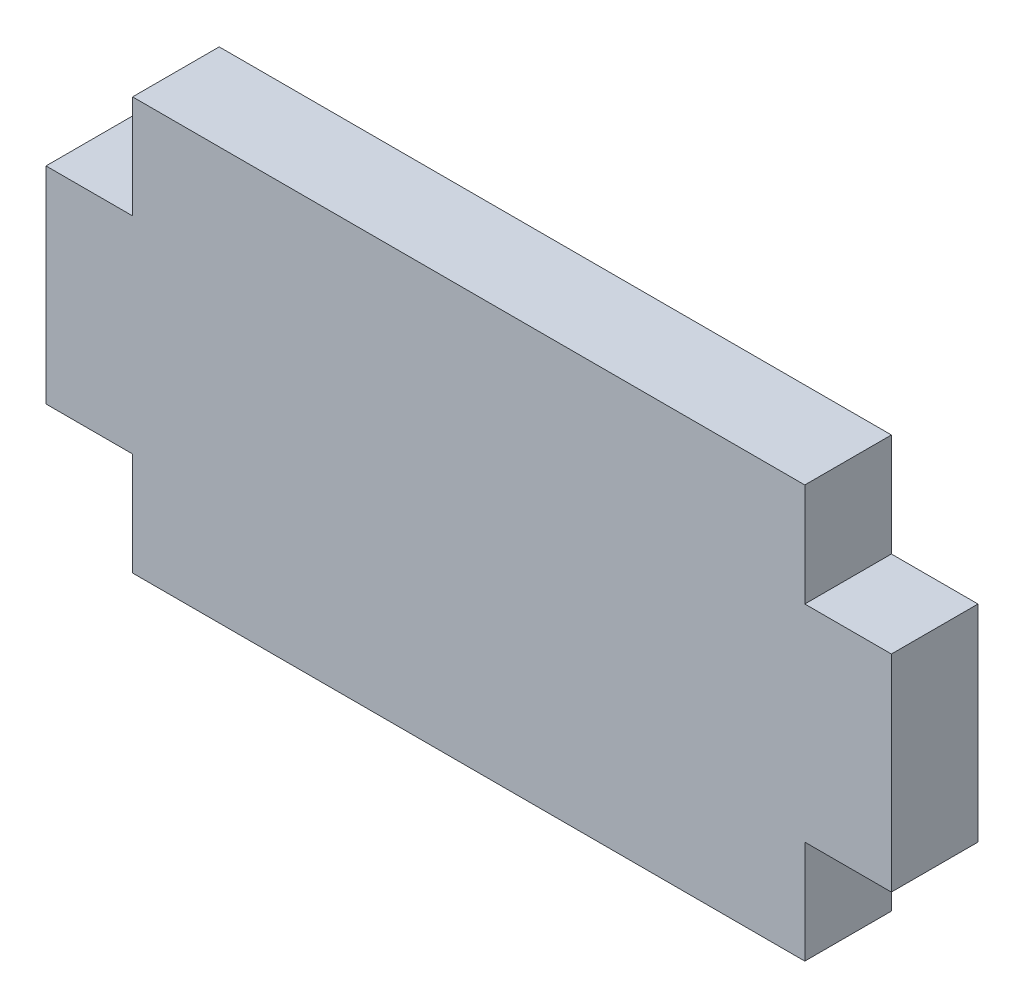
ISO-10303-21;
HEADER;
FILE_DESCRIPTION(('STEP AP214'),'2;1');
FILE_NAME('part.step','',(''),(''),'','','');
FILE_SCHEMA(('AUTOMOTIVE_DESIGN { 1 0 10303 214 1 1 1 1 }'));
ENDSEC;
DATA;
#1=APPLICATION_CONTEXT('core data for automotive mechanical design processes');
#2=APPLICATION_PROTOCOL_DEFINITION('international standard','automotive_design',2000,#1);
#3=PRODUCT_CONTEXT('',#1,'mechanical');
#4=PRODUCT('Part','Part','',(#3));
#5=PRODUCT_RELATED_PRODUCT_CATEGORY('part','',(#4));
#6=PRODUCT_DEFINITION_FORMATION('','',#4);
#7=PRODUCT_DEFINITION_CONTEXT('part definition',#1,'design');
#8=PRODUCT_DEFINITION('design','',#6,#7);
#9=PRODUCT_DEFINITION_SHAPE('','',#8);
#10=(LENGTH_UNIT() NAMED_UNIT(*) SI_UNIT(.MILLI.,.METRE.));
#11=(NAMED_UNIT(*) PLANE_ANGLE_UNIT() SI_UNIT($,.RADIAN.));
#12=(NAMED_UNIT(*) SI_UNIT($,.STERADIAN.) SOLID_ANGLE_UNIT());
#13=UNCERTAINTY_MEASURE_WITH_UNIT(LENGTH_MEASURE(1.E-05),#10,'distance_accuracy_value','');
#14=(GEOMETRIC_REPRESENTATION_CONTEXT(3) GLOBAL_UNCERTAINTY_ASSIGNED_CONTEXT((#13)) GLOBAL_UNIT_ASSIGNED_CONTEXT((#10,
#11,#12)) REPRESENTATION_CONTEXT('',''));
#15=CARTESIAN_POINT('',(0.,0.,0.));
#16=DIRECTION('',(0.,0.,1.));
#17=DIRECTION('',(1.,0.,0.));
#18=AXIS2_PLACEMENT_3D('',#15,#16,#17);
#19=CARTESIAN_POINT('',(-112.840766510892,6.6832526068117,5.334));
#20=DIRECTION('',(1.,0.,0.));
#21=DIRECTION('',(0.,0.,-1.));
#22=AXIS2_PLACEMENT_3D('',#19,#20,#21);
#23=PLANE('',#22);
#24=DIRECTION('',(0.,-1.,0.));
#25=VECTOR('',#24,1.);
#26=CARTESIAN_POINT('',(-112.840766510892,6.6832526068117,0.));
#27=LINE('',#26,#25);
#28=CARTESIAN_POINT('',(-112.840766510892,0.333252606811682,0.));
#29=VERTEX_POINT('',#28);
#30=CARTESIAN_POINT('',(-112.840766510892,-12.3667473931883,0.));
#31=VERTEX_POINT('',#30);
#32=EDGE_CURVE('E156',#29,#31,#27,.T.);
#33=ORIENTED_EDGE('',*,*,#32,.T.);
#34=DIRECTION('',(0.,0.,1.));
#35=VECTOR('',#34,1.);
#36=CARTESIAN_POINT('',(-112.840766510892,-12.3667473931883,0.));
#37=LINE('',#36,#35);
#38=CARTESIAN_POINT('',(-112.840766510892,-12.3667473931883,5.334));
#39=VERTEX_POINT('',#38);
#40=EDGE_CURVE('E178',#31,#39,#37,.T.);
#41=ORIENTED_EDGE('',*,*,#40,.T.);
#42=DIRECTION('',(0.,-1.,0.));
#43=VECTOR('',#42,1.);
#44=CARTESIAN_POINT('',(-112.840766510892,6.6832526068117,5.334));
#45=LINE('',#44,#43);
#46=CARTESIAN_POINT('',(-112.840766510892,0.333252606811682,5.334));
#47=VERTEX_POINT('',#46);
#48=EDGE_CURVE('E144',#47,#39,#45,.T.);
#49=ORIENTED_EDGE('',*,*,#48,.F.);
#50=DIRECTION('',(0.,0.,1.));
#51=VECTOR('',#50,1.);
#52=CARTESIAN_POINT('',(-112.840766510892,0.333252606811682,0.));
#53=LINE('',#52,#51);
#54=EDGE_CURVE('E166',#29,#47,#53,.T.);
#55=ORIENTED_EDGE('',*,*,#54,.F.);
#56=EDGE_LOOP('',(#33,#41,#49,#55));
#57=FACE_BOUND('',#56,.T.);
#58=ADVANCED_FACE('F35',(#57),#23,.F.);
#59=CARTESIAN_POINT('',(-112.840766510892,-18.7167473931883,5.334));
#60=DIRECTION('',(0.,1.,0.));
#61=DIRECTION('',(0.,0.,1.));
#62=AXIS2_PLACEMENT_3D('',#59,#60,#61);
#63=PLANE('',#62);
#64=DIRECTION('',(1.,0.,0.));
#65=VECTOR('',#64,1.);
#66=CARTESIAN_POINT('',(-112.840766510892,-18.7167473931883,0.));
#67=LINE('',#66,#65);
#68=CARTESIAN_POINT('',(-107.506766510892,-18.7167473931883,0.));
#69=VERTEX_POINT('',#68);
#70=CARTESIAN_POINT('',(-66.1047665108923,-18.7167473931883,0.));
#71=VERTEX_POINT('',#70);
#72=EDGE_CURVE('E150',#69,#71,#67,.T.);
#73=ORIENTED_EDGE('',*,*,#72,.T.);
#74=DIRECTION('',(0.,0.,1.));
#75=VECTOR('',#74,1.);
#76=CARTESIAN_POINT('',(-66.1047665108923,-18.7167473931883,0.));
#77=LINE('',#76,#75);
#78=CARTESIAN_POINT('',(-66.1047665108923,-18.7167473931883,5.334));
#79=VERTEX_POINT('',#78);
#80=EDGE_CURVE('E194',#71,#79,#77,.T.);
#81=ORIENTED_EDGE('',*,*,#80,.T.);
#82=DIRECTION('',(1.,0.,0.));
#83=VECTOR('',#82,1.);
#84=CARTESIAN_POINT('',(-112.840766510892,-18.7167473931883,5.334));
#85=LINE('',#84,#83);
#86=CARTESIAN_POINT('',(-107.506766510892,-18.7167473931883,5.334));
#87=VERTEX_POINT('',#86);
#88=EDGE_CURVE('E147',#87,#79,#85,.T.);
#89=ORIENTED_EDGE('',*,*,#88,.F.);
#90=DIRECTION('',(0.,0.,1.));
#91=VECTOR('',#90,1.);
#92=CARTESIAN_POINT('',(-107.506766510892,-18.7167473931883,0.));
#93=LINE('',#92,#91);
#94=EDGE_CURVE('E181',#69,#87,#93,.T.);
#95=ORIENTED_EDGE('',*,*,#94,.F.);
#96=EDGE_LOOP('',(#73,#81,#89,#95));
#97=FACE_BOUND('',#96,.T.);
#98=ADVANCED_FACE('F234',(#97),#63,.F.);
#99=CARTESIAN_POINT('',(-60.7707665108923,6.6832526068117,5.334));
#100=DIRECTION('',(-1.,0.,0.));
#101=DIRECTION('',(0.,0.,1.));
#102=AXIS2_PLACEMENT_3D('',#99,#100,#101);
#103=PLANE('',#102);
#104=DIRECTION('',(0.,1.,0.));
#105=VECTOR('',#104,1.);
#106=CARTESIAN_POINT('',(-60.7707665108923,6.6832526068117,0.));
#107=LINE('',#106,#105);
#108=CARTESIAN_POINT('',(-60.7707665108923,-12.3667473931883,0.));
#109=VERTEX_POINT('',#108);
#110=CARTESIAN_POINT('',(-60.7707665108923,0.333252606811702,0.));
#111=VERTEX_POINT('',#110);
#112=EDGE_CURVE('E145',#109,#111,#107,.T.);
#113=ORIENTED_EDGE('',*,*,#112,.T.);
#114=DIRECTION('',(0.,0.,1.));
#115=VECTOR('',#114,1.);
#116=CARTESIAN_POINT('',(-60.7707665108923,0.333252606811702,0.));
#117=LINE('',#116,#115);
#118=CARTESIAN_POINT('',(-60.7707665108923,0.333252606811702,5.334));
#119=VERTEX_POINT('',#118);
#120=EDGE_CURVE('E211',#111,#119,#117,.T.);
#121=ORIENTED_EDGE('',*,*,#120,.T.);
#122=DIRECTION('',(0.,1.,0.));
#123=VECTOR('',#122,1.);
#124=CARTESIAN_POINT('',(-60.7707665108923,6.6832526068117,5.334));
#125=LINE('',#124,#123);
#126=CARTESIAN_POINT('',(-60.7707665108923,-12.3667473931883,5.334));
#127=VERTEX_POINT('',#126);
#128=EDGE_CURVE('E43',#127,#119,#125,.T.);
#129=ORIENTED_EDGE('',*,*,#128,.F.);
#130=DIRECTION('',(0.,0.,1.));
#131=VECTOR('',#130,1.);
#132=CARTESIAN_POINT('',(-60.7707665108923,-12.3667473931883,0.));
#133=LINE('',#132,#131);
#134=EDGE_CURVE('E199',#109,#127,#133,.T.);
#135=ORIENTED_EDGE('',*,*,#134,.F.);
#136=EDGE_LOOP('',(#113,#121,#129,#135));
#137=FACE_BOUND('',#136,.T.);
#138=ADVANCED_FACE('F225',(#137),#103,.F.);
#139=CARTESIAN_POINT('',(-112.840766510892,6.6832526068117,5.334));
#140=DIRECTION('',(0.,-1.,0.));
#141=DIRECTION('',(0.,0.,-1.));
#142=AXIS2_PLACEMENT_3D('',#139,#140,#141);
#143=PLANE('',#142);
#144=DIRECTION('',(-1.,0.,0.));
#145=VECTOR('',#144,1.);
#146=CARTESIAN_POINT('',(-112.840766510892,6.6832526068117,5.334));
#147=LINE('',#146,#145);
#148=CARTESIAN_POINT('',(-66.1047665108923,6.68325260681171,5.334));
#149=VERTEX_POINT('',#148);
#150=CARTESIAN_POINT('',(-107.506766510892,6.68325260681168,5.334));
#151=VERTEX_POINT('',#150);
#152=EDGE_CURVE('E11',#149,#151,#147,.T.);
#153=ORIENTED_EDGE('',*,*,#152,.F.);
#154=DIRECTION('',(0.,0.,1.));
#155=VECTOR('',#154,1.);
#156=CARTESIAN_POINT('',(-66.1047665108923,6.68325260681171,0.));
#157=LINE('',#156,#155);
#158=CARTESIAN_POINT('',(-66.1047665108923,6.68325260681171,0.));
#159=VERTEX_POINT('',#158);
#160=EDGE_CURVE('E127',#159,#149,#157,.T.);
#161=ORIENTED_EDGE('',*,*,#160,.F.);
#162=DIRECTION('',(-1.,0.,0.));
#163=VECTOR('',#162,1.);
#164=CARTESIAN_POINT('',(-112.840766510892,6.6832526068117,0.));
#165=LINE('',#164,#163);
#166=CARTESIAN_POINT('',(-107.506766510892,6.68325260681168,0.));
#167=VERTEX_POINT('',#166);
#168=EDGE_CURVE('E38',#159,#167,#165,.T.);
#169=ORIENTED_EDGE('',*,*,#168,.T.);
#170=DIRECTION('',(0.,0.,1.));
#171=VECTOR('',#170,1.);
#172=CARTESIAN_POINT('',(-107.506766510892,6.68325260681168,0.));
#173=LINE('',#172,#171);
#174=EDGE_CURVE('E160',#167,#151,#173,.T.);
#175=ORIENTED_EDGE('',*,*,#174,.T.);
#176=EDGE_LOOP('',(#153,#161,#169,#175));
#177=FACE_BOUND('',#176,.T.);
#178=ADVANCED_FACE('F136',(#177),#143,.F.);
#179=CARTESIAN_POINT('',(0.,0.,5.334));
#180=DIRECTION('',(0.,0.,1.));
#181=DIRECTION('',(1.,0.,0.));
#182=AXIS2_PLACEMENT_3D('',#179,#180,#181);
#183=PLANE('',#182);
#184=DIRECTION('',(1.,0.,0.));
#185=VECTOR('',#184,1.);
#186=CARTESIAN_POINT('',(-60.7707665108923,0.333252606811702,5.334));
#187=LINE('',#186,#185);
#188=CARTESIAN_POINT('',(-66.1047665108923,0.333252606811707,5.334));
#189=VERTEX_POINT('',#188);
#190=EDGE_CURVE('E132',#189,#119,#187,.T.);
#191=ORIENTED_EDGE('',*,*,#190,.F.);
#192=DIRECTION('',(0.,-1.,0.));
#193=VECTOR('',#192,1.);
#194=CARTESIAN_POINT('',(-66.1047665108923,6.68325260681171,5.334));
#195=LINE('',#194,#193);
#196=EDGE_CURVE('E218',#149,#189,#195,.T.);
#197=ORIENTED_EDGE('',*,*,#196,.F.);
#198=ORIENTED_EDGE('',*,*,#152,.T.);
#199=DIRECTION('',(0.,1.,0.));
#200=VECTOR('',#199,1.);
#201=CARTESIAN_POINT('',(-107.506766510892,6.68325260681168,5.334));
#202=LINE('',#201,#200);
#203=CARTESIAN_POINT('',(-107.506766510892,0.333252606811682,5.334));
#204=VERTEX_POINT('',#203);
#205=EDGE_CURVE('E171',#204,#151,#202,.T.);
#206=ORIENTED_EDGE('',*,*,#205,.F.);
#207=DIRECTION('',(1.,0.,0.));
#208=VECTOR('',#207,1.);
#209=CARTESIAN_POINT('',(-112.840766510892,0.333252606811682,5.334));
#210=LINE('',#209,#208);
#211=EDGE_CURVE('E175',#47,#204,#210,.T.);
#212=ORIENTED_EDGE('',*,*,#211,.F.);
#213=ORIENTED_EDGE('',*,*,#48,.T.);
#214=DIRECTION('',(-1.,0.,0.));
#215=VECTOR('',#214,1.);
#216=CARTESIAN_POINT('',(-112.840766510892,-12.3667473931883,5.334));
#217=LINE('',#216,#215);
#218=CARTESIAN_POINT('',(-107.506766510892,-12.3667473931883,5.334));
#219=VERTEX_POINT('',#218);
#220=EDGE_CURVE('E188',#219,#39,#217,.T.);
#221=ORIENTED_EDGE('',*,*,#220,.F.);
#222=DIRECTION('',(0.,1.,0.));
#223=VECTOR('',#222,1.);
#224=CARTESIAN_POINT('',(-107.506766510892,-18.7167473931883,5.334));
#225=LINE('',#224,#223);
#226=EDGE_CURVE('E191',#87,#219,#225,.T.);
#227=ORIENTED_EDGE('',*,*,#226,.F.);
#228=ORIENTED_EDGE('',*,*,#88,.T.);
#229=DIRECTION('',(0.,-1.,0.));
#230=VECTOR('',#229,1.);
#231=CARTESIAN_POINT('',(-66.1047665108923,-18.7167473931883,5.334));
#232=LINE('',#231,#230);
#233=CARTESIAN_POINT('',(-66.1047665108923,-12.3667473931883,5.334));
#234=VERTEX_POINT('',#233);
#235=EDGE_CURVE('E205',#234,#79,#232,.T.);
#236=ORIENTED_EDGE('',*,*,#235,.F.);
#237=DIRECTION('',(-1.,0.,0.));
#238=VECTOR('',#237,1.);
#239=CARTESIAN_POINT('',(-60.7707665108923,-12.3667473931883,5.334));
#240=LINE('',#239,#238);
#241=EDGE_CURVE('E208',#127,#234,#240,.T.);
#242=ORIENTED_EDGE('',*,*,#241,.F.);
#243=ORIENTED_EDGE('',*,*,#128,.T.);
#244=EDGE_LOOP('',(#191,#197,#198,#206,#212,#213,#221,#227,#228,#236,#242,#243));
#245=FACE_BOUND('',#244,.T.);
#246=ADVANCED_FACE('F228',(#245),#183,.T.);
#247=CARTESIAN_POINT('',(0.,0.,0.));
#248=DIRECTION('',(0.,0.,1.));
#249=DIRECTION('',(1.,0.,0.));
#250=AXIS2_PLACEMENT_3D('',#247,#248,#249);
#251=PLANE('',#250);
#252=DIRECTION('',(0.,-1.,0.));
#253=VECTOR('',#252,1.);
#254=CARTESIAN_POINT('',(-66.1047665108923,6.68325260681171,0.));
#255=LINE('',#254,#253);
#256=CARTESIAN_POINT('',(-66.1047665108923,0.333252606811707,0.));
#257=VERTEX_POINT('',#256);
#258=EDGE_CURVE('E123',#159,#257,#255,.T.);
#259=ORIENTED_EDGE('',*,*,#258,.T.);
#260=DIRECTION('',(1.,0.,0.));
#261=VECTOR('',#260,1.);
#262=CARTESIAN_POINT('',(-60.7707665108923,0.333252606811702,0.));
#263=LINE('',#262,#261);
#264=EDGE_CURVE('E51',#257,#111,#263,.T.);
#265=ORIENTED_EDGE('',*,*,#264,.T.);
#266=ORIENTED_EDGE('',*,*,#112,.F.);
#267=DIRECTION('',(-1.,0.,0.));
#268=VECTOR('',#267,1.);
#269=CARTESIAN_POINT('',(-60.7707665108923,-12.3667473931883,0.));
#270=LINE('',#269,#268);
#271=CARTESIAN_POINT('',(-66.1047665108923,-12.3667473931883,0.));
#272=VERTEX_POINT('',#271);
#273=EDGE_CURVE('E207',#109,#272,#270,.T.);
#274=ORIENTED_EDGE('',*,*,#273,.T.);
#275=DIRECTION('',(0.,-1.,0.));
#276=VECTOR('',#275,1.);
#277=CARTESIAN_POINT('',(-66.1047665108923,-18.7167473931883,0.));
#278=LINE('',#277,#276);
#279=EDGE_CURVE('E59',#272,#71,#278,.T.);
#280=ORIENTED_EDGE('',*,*,#279,.T.);
#281=ORIENTED_EDGE('',*,*,#72,.F.);
#282=DIRECTION('',(0.,1.,0.));
#283=VECTOR('',#282,1.);
#284=CARTESIAN_POINT('',(-107.506766510892,-18.7167473931883,0.));
#285=LINE('',#284,#283);
#286=CARTESIAN_POINT('',(-107.506766510892,-12.3667473931883,0.));
#287=VERTEX_POINT('',#286);
#288=EDGE_CURVE('E190',#69,#287,#285,.T.);
#289=ORIENTED_EDGE('',*,*,#288,.T.);
#290=DIRECTION('',(-1.,0.,0.));
#291=VECTOR('',#290,1.);
#292=CARTESIAN_POINT('',(-112.840766510892,-12.3667473931883,0.));
#293=LINE('',#292,#291);
#294=EDGE_CURVE('E184',#287,#31,#293,.T.);
#295=ORIENTED_EDGE('',*,*,#294,.T.);
#296=ORIENTED_EDGE('',*,*,#32,.F.);
#297=DIRECTION('',(1.,0.,0.));
#298=VECTOR('',#297,1.);
#299=CARTESIAN_POINT('',(-112.840766510892,0.333252606811682,0.));
#300=LINE('',#299,#298);
#301=CARTESIAN_POINT('',(-107.506766510892,0.333252606811682,0.));
#302=VERTEX_POINT('',#301);
#303=EDGE_CURVE('E174',#29,#302,#300,.T.);
#304=ORIENTED_EDGE('',*,*,#303,.T.);
#305=DIRECTION('',(0.,1.,0.));
#306=VECTOR('',#305,1.);
#307=CARTESIAN_POINT('',(-107.506766510892,6.68325260681168,0.));
#308=LINE('',#307,#306);
#309=EDGE_CURVE('E143',#302,#167,#308,.T.);
#310=ORIENTED_EDGE('',*,*,#309,.T.);
#311=ORIENTED_EDGE('',*,*,#168,.F.);
#312=EDGE_LOOP('',(#259,#265,#266,#274,#280,#281,#289,#295,#296,#304,#310,#311));
#313=FACE_BOUND('',#312,.T.);
#314=ADVANCED_FACE('F141',(#313),#251,.F.);
#315=CARTESIAN_POINT('',(-107.506766510892,6.68325260681168,0.));
#316=DIRECTION('',(1.,0.,0.));
#317=DIRECTION('',(0.,0.,-1.));
#318=AXIS2_PLACEMENT_3D('',#315,#316,#317);
#319=PLANE('',#318);
#320=ORIENTED_EDGE('',*,*,#205,.T.);
#321=ORIENTED_EDGE('',*,*,#174,.F.);
#322=ORIENTED_EDGE('',*,*,#309,.F.);
#323=DIRECTION('',(0.,0.,1.));
#324=VECTOR('',#323,1.);
#325=CARTESIAN_POINT('',(-107.506766510892,0.333252606811682,0.));
#326=LINE('',#325,#324);
#327=EDGE_CURVE('E168',#302,#204,#326,.T.);
#328=ORIENTED_EDGE('',*,*,#327,.T.);
#329=EDGE_LOOP('',(#320,#321,#322,#328));
#330=FACE_BOUND('',#329,.T.);
#331=ADVANCED_FACE('F252',(#330),#319,.F.);
#332=CARTESIAN_POINT('',(-112.840766510892,0.333252606811682,0.));
#333=DIRECTION('',(0.,-1.,0.));
#334=DIRECTION('',(0.,0.,-1.));
#335=AXIS2_PLACEMENT_3D('',#332,#333,#334);
#336=PLANE('',#335);
#337=ORIENTED_EDGE('',*,*,#211,.T.);
#338=ORIENTED_EDGE('',*,*,#327,.F.);
#339=ORIENTED_EDGE('',*,*,#303,.F.);
#340=ORIENTED_EDGE('',*,*,#54,.T.);
#341=EDGE_LOOP('',(#337,#338,#339,#340));
#342=FACE_BOUND('',#341,.T.);
#343=ADVANCED_FACE('F250',(#342),#336,.F.);
#344=CARTESIAN_POINT('',(-112.840766510892,-12.3667473931883,0.));
#345=DIRECTION('',(0.,1.,0.));
#346=DIRECTION('',(0.,0.,1.));
#347=AXIS2_PLACEMENT_3D('',#344,#345,#346);
#348=PLANE('',#347);
#349=ORIENTED_EDGE('',*,*,#220,.T.);
#350=ORIENTED_EDGE('',*,*,#40,.F.);
#351=ORIENTED_EDGE('',*,*,#294,.F.);
#352=DIRECTION('',(0.,0.,1.));
#353=VECTOR('',#352,1.);
#354=CARTESIAN_POINT('',(-107.506766510892,-12.3667473931883,0.));
#355=LINE('',#354,#353);
#356=EDGE_CURVE('E183',#287,#219,#355,.T.);
#357=ORIENTED_EDGE('',*,*,#356,.T.);
#358=EDGE_LOOP('',(#349,#350,#351,#357));
#359=FACE_BOUND('',#358,.T.);
#360=ADVANCED_FACE('F242',(#359),#348,.F.);
#361=CARTESIAN_POINT('',(-107.506766510892,-18.7167473931883,0.));
#362=DIRECTION('',(1.,0.,0.));
#363=DIRECTION('',(0.,0.,-1.));
#364=AXIS2_PLACEMENT_3D('',#361,#362,#363);
#365=PLANE('',#364);
#366=ORIENTED_EDGE('',*,*,#226,.T.);
#367=ORIENTED_EDGE('',*,*,#356,.F.);
#368=ORIENTED_EDGE('',*,*,#288,.F.);
#369=ORIENTED_EDGE('',*,*,#94,.T.);
#370=EDGE_LOOP('',(#366,#367,#368,#369));
#371=FACE_BOUND('',#370,.T.);
#372=ADVANCED_FACE('F239',(#371),#365,.F.);
#373=CARTESIAN_POINT('',(-66.1047665108923,-18.7167473931883,0.));
#374=DIRECTION('',(-1.,0.,0.));
#375=DIRECTION('',(0.,0.,1.));
#376=AXIS2_PLACEMENT_3D('',#373,#374,#375);
#377=PLANE('',#376);
#378=ORIENTED_EDGE('',*,*,#235,.T.);
#379=ORIENTED_EDGE('',*,*,#80,.F.);
#380=ORIENTED_EDGE('',*,*,#279,.F.);
#381=DIRECTION('',(0.,0.,1.));
#382=VECTOR('',#381,1.);
#383=CARTESIAN_POINT('',(-66.1047665108923,-12.3667473931883,0.));
#384=LINE('',#383,#382);
#385=EDGE_CURVE('E201',#272,#234,#384,.T.);
#386=ORIENTED_EDGE('',*,*,#385,.T.);
#387=EDGE_LOOP('',(#378,#379,#380,#386));
#388=FACE_BOUND('',#387,.T.);
#389=ADVANCED_FACE('F232',(#388),#377,.F.);
#390=CARTESIAN_POINT('',(-60.7707665108923,-12.3667473931883,0.));
#391=DIRECTION('',(0.,1.,0.));
#392=DIRECTION('',(-1.,0.,0.));
#393=AXIS2_PLACEMENT_3D('',#390,#391,#392);
#394=PLANE('',#393);
#395=ORIENTED_EDGE('',*,*,#241,.T.);
#396=ORIENTED_EDGE('',*,*,#385,.F.);
#397=ORIENTED_EDGE('',*,*,#273,.F.);
#398=ORIENTED_EDGE('',*,*,#134,.T.);
#399=EDGE_LOOP('',(#395,#396,#397,#398));
#400=FACE_BOUND('',#399,.T.);
#401=ADVANCED_FACE('F222',(#400),#394,.F.);
#402=CARTESIAN_POINT('',(-60.7707665108923,0.333252606811702,0.));
#403=DIRECTION('',(0.,-1.,0.));
#404=DIRECTION('',(1.,0.,0.));
#405=AXIS2_PLACEMENT_3D('',#402,#403,#404);
#406=PLANE('',#405);
#407=ORIENTED_EDGE('',*,*,#190,.T.);
#408=ORIENTED_EDGE('',*,*,#120,.F.);
#409=ORIENTED_EDGE('',*,*,#264,.F.);
#410=DIRECTION('',(0.,0.,1.));
#411=VECTOR('',#410,1.);
#412=CARTESIAN_POINT('',(-66.1047665108923,0.333252606811707,0.));
#413=LINE('',#412,#411);
#414=EDGE_CURVE('E129',#257,#189,#413,.T.);
#415=ORIENTED_EDGE('',*,*,#414,.T.);
#416=EDGE_LOOP('',(#407,#408,#409,#415));
#417=FACE_BOUND('',#416,.T.);
#418=ADVANCED_FACE('F324',(#417),#406,.F.);
#419=CARTESIAN_POINT('',(-66.1047665108923,6.68325260681171,0.));
#420=DIRECTION('',(-1.,0.,0.));
#421=DIRECTION('',(0.,0.,1.));
#422=AXIS2_PLACEMENT_3D('',#419,#420,#421);
#423=PLANE('',#422);
#424=ORIENTED_EDGE('',*,*,#196,.T.);
#425=ORIENTED_EDGE('',*,*,#414,.F.);
#426=ORIENTED_EDGE('',*,*,#258,.F.);
#427=ORIENTED_EDGE('',*,*,#160,.T.);
#428=EDGE_LOOP('',(#424,#425,#426,#427));
#429=FACE_BOUND('',#428,.T.);
#430=ADVANCED_FACE('F126',(#429),#423,.F.);
#431=CLOSED_SHELL('',(#58,#98,#138,#178,#246,#314,#331,#343,#360,#372,#389,#401,#418,#430));
#432=MANIFOLD_SOLID_BREP('B2',#431);
#433=ADVANCED_BREP_SHAPE_REPRESENTATION('',(#18,#432),#14);
#434=SHAPE_DEFINITION_REPRESENTATION(#9,#433);
ENDSEC;
END-ISO-10303-21;
